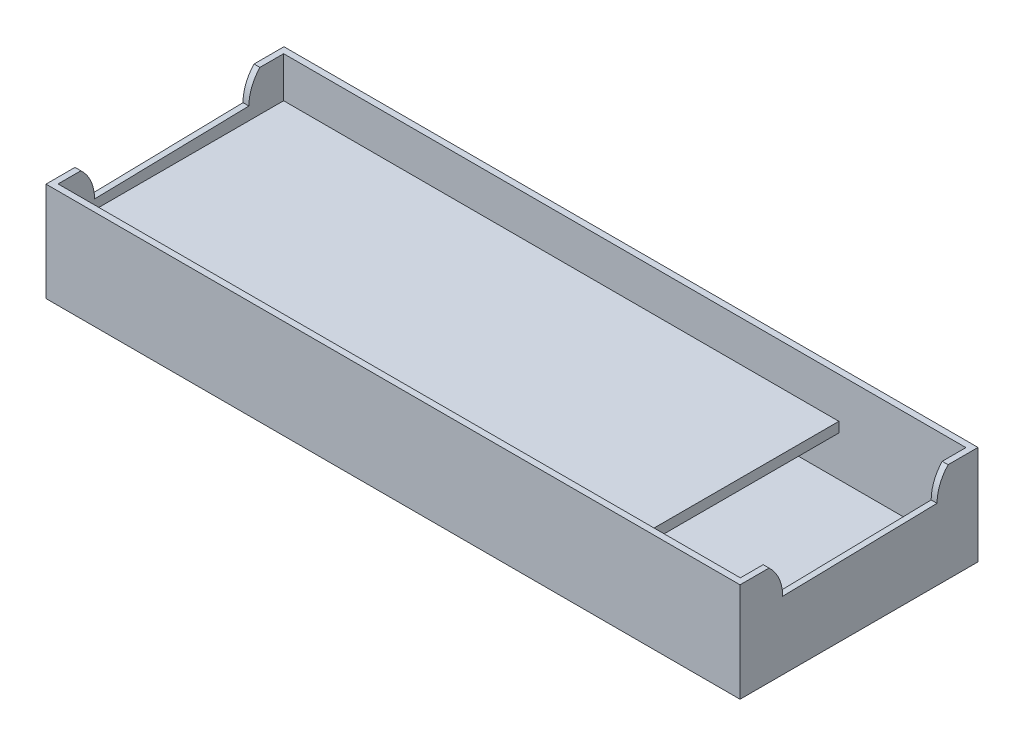
ISO-10303-21;
HEADER;
FILE_DESCRIPTION(('STEP AP214'),'2;1');
FILE_NAME('part.step','',(''),(''),'','','');
FILE_SCHEMA(('AUTOMOTIVE_DESIGN { 1 0 10303 214 1 1 1 1 }'));
ENDSEC;
DATA;
#1=APPLICATION_CONTEXT('core data for automotive mechanical design processes');
#2=APPLICATION_PROTOCOL_DEFINITION('international standard','automotive_design',2000,#1);
#3=PRODUCT_CONTEXT('',#1,'mechanical');
#4=PRODUCT('Part','Part','',(#3));
#5=PRODUCT_RELATED_PRODUCT_CATEGORY('part','',(#4));
#6=PRODUCT_DEFINITION_FORMATION('','',#4);
#7=PRODUCT_DEFINITION_CONTEXT('part definition',#1,'design');
#8=PRODUCT_DEFINITION('design','',#6,#7);
#9=PRODUCT_DEFINITION_SHAPE('','',#8);
#10=(LENGTH_UNIT() NAMED_UNIT(*) SI_UNIT(.MILLI.,.METRE.));
#11=(NAMED_UNIT(*) PLANE_ANGLE_UNIT() SI_UNIT($,.RADIAN.));
#12=(NAMED_UNIT(*) SI_UNIT($,.STERADIAN.) SOLID_ANGLE_UNIT());
#13=UNCERTAINTY_MEASURE_WITH_UNIT(LENGTH_MEASURE(1.E-05),#10,'distance_accuracy_value','');
#14=(GEOMETRIC_REPRESENTATION_CONTEXT(3) GLOBAL_UNCERTAINTY_ASSIGNED_CONTEXT((#13)) GLOBAL_UNIT_ASSIGNED_CONTEXT((#10,
#11,#12)) REPRESENTATION_CONTEXT('',''));
#15=CARTESIAN_POINT('',(0.,0.,0.));
#16=DIRECTION('',(0.,0.,1.));
#17=DIRECTION('',(1.,0.,0.));
#18=AXIS2_PLACEMENT_3D('',#15,#16,#17);
#19=CARTESIAN_POINT('',(-86.0187095266275,2.,-28.4391549564411));
#20=DIRECTION('',(-1.,0.,0.));
#21=DIRECTION('',(0.,0.,1.));
#22=AXIS2_PLACEMENT_3D('',#19,#20,#21);
#23=PLANE('',#22);
#24=DIRECTION('',(0.,0.,-1.));
#25=VECTOR('',#24,1.);
#26=CARTESIAN_POINT('',(-86.0187095266275,12.1793605566936,28.1805172130793));
#27=LINE('',#26,#25);
#28=CARTESIAN_POINT('',(-86.0187095266275,12.1793605566936,28.1805172130793));
#29=VERTEX_POINT('',#28);
#30=CARTESIAN_POINT('',(-86.0187095266275,12.1793605566936,-28.4391549564411));
#31=VERTEX_POINT('',#30);
#32=EDGE_CURVE('E533',#29,#31,#27,.T.);
#33=ORIENTED_EDGE('',*,*,#32,.F.);
#34=DIRECTION('',(0.,-1.,0.));
#35=VECTOR('',#34,1.);
#36=CARTESIAN_POINT('',(-86.0187095266275,14.7226214599172,28.1805172130793));
#37=LINE('',#36,#35);
#38=CARTESIAN_POINT('',(-86.0187095266275,14.7226214599172,28.1805172130793));
#39=VERTEX_POINT('',#38);
#40=EDGE_CURVE('E189',#39,#29,#37,.T.);
#41=ORIENTED_EDGE('',*,*,#40,.F.);
#42=DIRECTION('',(0.,0.,1.));
#43=VECTOR('',#42,1.);
#44=CARTESIAN_POINT('',(-86.0187095266275,14.7226214599172,28.1805172130793));
#45=LINE('',#44,#43);
#46=CARTESIAN_POINT('',(-86.0187095266275,14.7226214599172,-28.4391549564411));
#47=VERTEX_POINT('',#46);
#48=EDGE_CURVE('E185',#47,#39,#45,.T.);
#49=ORIENTED_EDGE('',*,*,#48,.F.);
#50=DIRECTION('',(0.,1.,0.));
#51=VECTOR('',#50,1.);
#52=CARTESIAN_POINT('',(-86.0187095266275,2.,-28.4391549564411));
#53=LINE('',#52,#51);
#54=CARTESIAN_POINT('',(-86.0187095266275,25.,-28.4391549564411));
#55=VERTEX_POINT('',#54);
#56=EDGE_CURVE('E269',#47,#55,#53,.T.);
#57=ORIENTED_EDGE('',*,*,#56,.T.);
#58=DIRECTION('',(0.,0.,1.));
#59=VECTOR('',#58,1.);
#60=CARTESIAN_POINT('',(-86.0187095266275,25.,-28.4391549564411));
#61=LINE('',#60,#59);
#62=CARTESIAN_POINT('',(-86.0187095266275,25.,-22.4526280085783));
#63=VERTEX_POINT('',#62);
#64=EDGE_CURVE('E255',#55,#63,#61,.T.);
#65=ORIENTED_EDGE('',*,*,#64,.T.);
#66=CARTESIAN_POINT('',(-86.0187095266275,17.9512963465704,-30.));
#67=DIRECTION('',(-1.,0.,0.));
#68=DIRECTION('',(0.,0.,1.));
#69=AXIS2_PLACEMENT_3D('',#66,#67,#68);
#70=CIRCLE('',#69,10.3270057214455);
#71=CARTESIAN_POINT('',(-86.0187095266275,17.9512963465704,-19.6729942785545));
#72=VERTEX_POINT('',#71);
#73=EDGE_CURVE('E12',#72,#63,#70,.T.);
#74=ORIENTED_EDGE('',*,*,#73,.F.);
#75=DIRECTION('',(0.,-0.0214904779381485,0.999769053010739));
#76=VECTOR('',#75,1.);
#77=CARTESIAN_POINT('',(-86.0187095266275,18.1322748644069,-28.0923845737996));
#78=LINE('',#77,#76);
#79=CARTESIAN_POINT('',(-86.0187095266275,17.1148019535767,19.2419712023932));
#80=VERTEX_POINT('',#79);
#81=EDGE_CURVE('E42',#72,#80,#78,.T.);
#82=ORIENTED_EDGE('',*,*,#81,.T.);
#83=CARTESIAN_POINT('',(-86.0187095266275,17.1148019535767,30.));
#84=DIRECTION('',(-1.,0.,0.));
#85=DIRECTION('',(0.,0.,1.));
#86=AXIS2_PLACEMENT_3D('',#83,#84,#85);
#87=CIRCLE('',#86,10.7580287976068);
#88=CARTESIAN_POINT('',(-86.0187095266275,25.,22.68160978228));
#89=VERTEX_POINT('',#88);
#90=EDGE_CURVE('E304',#89,#80,#87,.T.);
#91=ORIENTED_EDGE('',*,*,#90,.F.);
#92=CARTESIAN_POINT('',(-86.0187095266275,25.,28.4391549564411));
#93=VERTEX_POINT('',#92);
#94=EDGE_CURVE('E254',#89,#93,#61,.T.);
#95=ORIENTED_EDGE('',*,*,#94,.T.);
#96=DIRECTION('',(0.,1.,0.));
#97=VECTOR('',#96,1.);
#98=CARTESIAN_POINT('',(-86.0187095266275,2.,28.4391549564411));
#99=LINE('',#98,#97);
#100=CARTESIAN_POINT('',(-86.0187095266275,2.,28.4391549564411));
#101=VERTEX_POINT('',#100);
#102=EDGE_CURVE('E263',#101,#93,#99,.T.);
#103=ORIENTED_EDGE('',*,*,#102,.F.);
#104=DIRECTION('',(0.,0.,1.));
#105=VECTOR('',#104,1.);
#106=CARTESIAN_POINT('',(-86.0187095266275,2.,-28.4391549564411));
#107=LINE('',#106,#105);
#108=CARTESIAN_POINT('',(-86.0187095266275,2.,-28.4391549564411));
#109=VERTEX_POINT('',#108);
#110=EDGE_CURVE('E241',#109,#101,#107,.T.);
#111=ORIENTED_EDGE('',*,*,#110,.F.);
#112=EDGE_CURVE('E266',#109,#31,#53,.T.);
#113=ORIENTED_EDGE('',*,*,#112,.T.);
#114=EDGE_LOOP('',(#33,#41,#49,#57,#65,#74,#82,#91,#95,#103,#111,#113));
#115=FACE_BOUND('',#114,.T.);
#116=ADVANCED_FACE('F34',(#115),#23,.F.);
#117=CARTESIAN_POINT('',(-86.0187095266275,2.,-28.4391549564411));
#118=DIRECTION('',(0.,0.,-1.));
#119=DIRECTION('',(-1.,0.,0.));
#120=AXIS2_PLACEMENT_3D('',#117,#118,#119);
#121=PLANE('',#120);
#122=DIRECTION('',(-1.,0.,0.));
#123=VECTOR('',#122,1.);
#124=CARTESIAN_POINT('',(53.9812904733725,12.1793605566936,-28.4391549564411));
#125=LINE('',#124,#123);
#126=CARTESIAN_POINT('',(53.9812904733725,12.1793605566936,-28.4391549564411));
#127=VERTEX_POINT('',#126);
#128=EDGE_CURVE('E49',#127,#31,#125,.T.);
#129=ORIENTED_EDGE('',*,*,#128,.T.);
#130=ORIENTED_EDGE('',*,*,#112,.F.);
#131=DIRECTION('',(-1.,0.,0.));
#132=VECTOR('',#131,1.);
#133=CARTESIAN_POINT('',(-86.0187095266275,2.,-28.4391549564411));
#134=LINE('',#133,#132);
#135=CARTESIAN_POINT('',(86.0187095266275,2.,-28.4391549564411));
#136=VERTEX_POINT('',#135);
#137=EDGE_CURVE('E237',#136,#109,#134,.T.);
#138=ORIENTED_EDGE('',*,*,#137,.F.);
#139=DIRECTION('',(0.,1.,0.));
#140=VECTOR('',#139,1.);
#141=CARTESIAN_POINT('',(86.0187095266275,2.,-28.4391549564411));
#142=LINE('',#141,#140);
#143=CARTESIAN_POINT('',(86.0187095266275,25.,-28.4391549564411));
#144=VERTEX_POINT('',#143);
#145=EDGE_CURVE('E247',#136,#144,#142,.T.);
#146=ORIENTED_EDGE('',*,*,#145,.T.);
#147=DIRECTION('',(-1.,0.,0.));
#148=VECTOR('',#147,1.);
#149=CARTESIAN_POINT('',(-86.0187095266275,25.,-28.4391549564411));
#150=LINE('',#149,#148);
#151=EDGE_CURVE('E251',#144,#55,#150,.T.);
#152=ORIENTED_EDGE('',*,*,#151,.T.);
#153=ORIENTED_EDGE('',*,*,#56,.F.);
#154=DIRECTION('',(-1.,0.,0.));
#155=VECTOR('',#154,1.);
#156=CARTESIAN_POINT('',(53.9812904733725,14.7226214599172,-28.4391549564411));
#157=LINE('',#156,#155);
#158=CARTESIAN_POINT('',(53.9812904733725,14.7226214599172,-28.4391549564411));
#159=VERTEX_POINT('',#158);
#160=EDGE_CURVE('E196',#159,#47,#157,.T.);
#161=ORIENTED_EDGE('',*,*,#160,.F.);
#162=DIRECTION('',(0.,1.,0.));
#163=VECTOR('',#162,1.);
#164=CARTESIAN_POINT('',(53.9812904733725,14.7226214599172,-28.4391549564411));
#165=LINE('',#164,#163);
#166=EDGE_CURVE('E175',#127,#159,#165,.T.);
#167=ORIENTED_EDGE('',*,*,#166,.F.);
#168=EDGE_LOOP('',(#129,#130,#138,#146,#152,#153,#161,#167));
#169=FACE_BOUND('',#168,.T.);
#170=ADVANCED_FACE('F368',(#169),#121,.F.);
#171=CARTESIAN_POINT('',(87.5,25.,-30.));
#172=DIRECTION('',(-1.,0.,0.));
#173=DIRECTION('',(0.,0.,1.));
#174=AXIS2_PLACEMENT_3D('',#171,#172,#173);
#175=PLANE('',#174);
#176=CARTESIAN_POINT('',(87.5,17.9512963465704,-30.));
#177=DIRECTION('',(1.,0.,0.));
#178=DIRECTION('',(0.,0.,-1.));
#179=AXIS2_PLACEMENT_3D('',#176,#177,#178);
#180=CIRCLE('',#179,10.3270057214455);
#181=CARTESIAN_POINT('',(87.5,25.,-22.4526280085783));
#182=VERTEX_POINT('',#181);
#183=CARTESIAN_POINT('',(87.5,17.9512963465704,-19.6729942785545));
#184=VERTEX_POINT('',#183);
#185=EDGE_CURVE('E191',#182,#184,#180,.T.);
#186=ORIENTED_EDGE('',*,*,#185,.T.);
#187=DIRECTION('',(0.,0.0214904779381485,-0.999769053010739));
#188=VECTOR('',#187,1.);
#189=CARTESIAN_POINT('',(87.5,17.5203212990617,0.376607054612156));
#190=LINE('',#189,#188);
#191=CARTESIAN_POINT('',(87.5,17.1148019535767,19.2419712023932));
#192=VERTEX_POINT('',#191);
#193=EDGE_CURVE('E203',#192,#184,#190,.T.);
#194=ORIENTED_EDGE('',*,*,#193,.F.);
#195=CARTESIAN_POINT('',(87.5,17.1148019535767,30.));
#196=DIRECTION('',(1.,0.,0.));
#197=DIRECTION('',(0.,0.,-1.));
#198=AXIS2_PLACEMENT_3D('',#195,#196,#197);
#199=CIRCLE('',#198,10.7580287976068);
#200=CARTESIAN_POINT('',(87.5,25.,22.68160978228));
#201=VERTEX_POINT('',#200);
#202=EDGE_CURVE('E194',#192,#201,#199,.T.);
#203=ORIENTED_EDGE('',*,*,#202,.T.);
#204=DIRECTION('',(0.,0.,-1.));
#205=VECTOR('',#204,1.);
#206=CARTESIAN_POINT('',(87.5,25.,-30.));
#207=LINE('',#206,#205);
#208=CARTESIAN_POINT('',(87.5,25.,30.));
#209=VERTEX_POINT('',#208);
#210=EDGE_CURVE('E272',#209,#201,#207,.T.);
#211=ORIENTED_EDGE('',*,*,#210,.F.);
#212=DIRECTION('',(0.,-1.,0.));
#213=VECTOR('',#212,1.);
#214=CARTESIAN_POINT('',(87.5,25.,30.));
#215=LINE('',#214,#213);
#216=CARTESIAN_POINT('',(87.5,0.,30.));
#217=VERTEX_POINT('',#216);
#218=EDGE_CURVE('E284',#209,#217,#215,.T.);
#219=ORIENTED_EDGE('',*,*,#218,.T.);
#220=DIRECTION('',(0.,0.,-1.));
#221=VECTOR('',#220,1.);
#222=CARTESIAN_POINT('',(87.5,0.,-30.));
#223=LINE('',#222,#221);
#224=CARTESIAN_POINT('',(87.5,0.,-30.));
#225=VERTEX_POINT('',#224);
#226=EDGE_CURVE('E262',#217,#225,#223,.T.);
#227=ORIENTED_EDGE('',*,*,#226,.T.);
#228=DIRECTION('',(0.,-1.,0.));
#229=VECTOR('',#228,1.);
#230=CARTESIAN_POINT('',(87.5,25.,-30.));
#231=LINE('',#230,#229);
#232=CARTESIAN_POINT('',(87.5,25.,-30.));
#233=VERTEX_POINT('',#232);
#234=EDGE_CURVE('E301',#233,#225,#231,.T.);
#235=ORIENTED_EDGE('',*,*,#234,.F.);
#236=EDGE_CURVE('E276',#182,#233,#207,.T.);
#237=ORIENTED_EDGE('',*,*,#236,.F.);
#238=EDGE_LOOP('',(#186,#194,#203,#211,#219,#227,#235,#237));
#239=FACE_BOUND('',#238,.T.);
#240=ADVANCED_FACE('F36',(#239),#175,.F.);
#241=CARTESIAN_POINT('',(-87.5,25.,-30.));
#242=DIRECTION('',(1.,0.,0.));
#243=DIRECTION('',(0.,0.,-1.));
#244=AXIS2_PLACEMENT_3D('',#241,#242,#243);
#245=PLANE('',#244);
#246=CARTESIAN_POINT('',(-87.5,17.9512963465704,-30.));
#247=DIRECTION('',(1.,0.,0.));
#248=DIRECTION('',(0.,0.,-1.));
#249=AXIS2_PLACEMENT_3D('',#246,#247,#248);
#250=CIRCLE('',#249,10.3270057214455);
#251=CARTESIAN_POINT('',(-87.5,25.,-22.4526280085783));
#252=VERTEX_POINT('',#251);
#253=CARTESIAN_POINT('',(-87.5,17.9512963465704,-19.6729942785545));
#254=VERTEX_POINT('',#253);
#255=EDGE_CURVE('E200',#252,#254,#250,.T.);
#256=ORIENTED_EDGE('',*,*,#255,.F.);
#257=DIRECTION('',(0.,0.,1.));
#258=VECTOR('',#257,1.);
#259=CARTESIAN_POINT('',(-87.5,25.,-30.));
#260=LINE('',#259,#258);
#261=CARTESIAN_POINT('',(-87.5,25.,-30.));
#262=VERTEX_POINT('',#261);
#263=EDGE_CURVE('E279',#262,#252,#260,.T.);
#264=ORIENTED_EDGE('',*,*,#263,.F.);
#265=DIRECTION('',(0.,-1.,0.));
#266=VECTOR('',#265,1.);
#267=CARTESIAN_POINT('',(-87.5,25.,-30.));
#268=LINE('',#267,#266);
#269=CARTESIAN_POINT('',(-87.5,0.,-30.));
#270=VERTEX_POINT('',#269);
#271=EDGE_CURVE('E298',#262,#270,#268,.T.);
#272=ORIENTED_EDGE('',*,*,#271,.T.);
#273=DIRECTION('',(0.,0.,1.));
#274=VECTOR('',#273,1.);
#275=CARTESIAN_POINT('',(-87.5,0.,-30.));
#276=LINE('',#275,#274);
#277=CARTESIAN_POINT('',(-87.5,0.,30.));
#278=VERTEX_POINT('',#277);
#279=EDGE_CURVE('E289',#270,#278,#276,.T.);
#280=ORIENTED_EDGE('',*,*,#279,.T.);
#281=DIRECTION('',(0.,-1.,0.));
#282=VECTOR('',#281,1.);
#283=CARTESIAN_POINT('',(-87.5,25.,30.));
#284=LINE('',#283,#282);
#285=CARTESIAN_POINT('',(-87.5,25.,30.));
#286=VERTEX_POINT('',#285);
#287=EDGE_CURVE('E295',#286,#278,#284,.T.);
#288=ORIENTED_EDGE('',*,*,#287,.F.);
#289=CARTESIAN_POINT('',(-87.5,25.,22.68160978228));
#290=VERTEX_POINT('',#289);
#291=EDGE_CURVE('E278',#290,#286,#260,.T.);
#292=ORIENTED_EDGE('',*,*,#291,.F.);
#293=CARTESIAN_POINT('',(-87.5,17.1148019535767,30.));
#294=DIRECTION('',(1.,0.,0.));
#295=DIRECTION('',(0.,0.,-1.));
#296=AXIS2_PLACEMENT_3D('',#293,#294,#295);
#297=CIRCLE('',#296,10.7580287976068);
#298=CARTESIAN_POINT('',(-87.5,17.1148019535767,19.2419712023932));
#299=VERTEX_POINT('',#298);
#300=EDGE_CURVE('E202',#299,#290,#297,.T.);
#301=ORIENTED_EDGE('',*,*,#300,.F.);
#302=DIRECTION('',(0.,0.0214904779381485,-0.999769053010739));
#303=VECTOR('',#302,1.);
#304=CARTESIAN_POINT('',(-87.5,17.5203212990617,0.376607054612156));
#305=LINE('',#304,#303);
#306=EDGE_CURVE('E205',#299,#254,#305,.T.);
#307=ORIENTED_EDGE('',*,*,#306,.T.);
#308=EDGE_LOOP('',(#256,#264,#272,#280,#288,#292,#301,#307));
#309=FACE_BOUND('',#308,.T.);
#310=ADVANCED_FACE('F319',(#309),#245,.F.);
#311=CARTESIAN_POINT('',(0.,25.,0.));
#312=DIRECTION('',(0.,1.,0.));
#313=DIRECTION('',(0.,0.,1.));
#314=AXIS2_PLACEMENT_3D('',#311,#312,#313);
#315=PLANE('',#314);
#316=ORIENTED_EDGE('',*,*,#263,.T.);
#317=DIRECTION('',(1.,0.,0.));
#318=VECTOR('',#317,1.);
#319=CARTESIAN_POINT('',(-87.5,25.,-22.4526280085783));
#320=LINE('',#319,#318);
#321=EDGE_CURVE('E224',#252,#63,#320,.T.);
#322=ORIENTED_EDGE('',*,*,#321,.T.);
#323=ORIENTED_EDGE('',*,*,#64,.F.);
#324=ORIENTED_EDGE('',*,*,#151,.F.);
#325=DIRECTION('',(0.,0.,-1.));
#326=VECTOR('',#325,1.);
#327=CARTESIAN_POINT('',(86.0187095266275,25.,-28.4391549564411));
#328=LINE('',#327,#326);
#329=CARTESIAN_POINT('',(86.0187095266275,25.,-22.4526280085783));
#330=VERTEX_POINT('',#329);
#331=EDGE_CURVE('E233',#330,#144,#328,.T.);
#332=ORIENTED_EDGE('',*,*,#331,.F.);
#333=EDGE_CURVE('E207',#330,#182,#320,.T.);
#334=ORIENTED_EDGE('',*,*,#333,.T.);
#335=ORIENTED_EDGE('',*,*,#236,.T.);
#336=DIRECTION('',(-1.,0.,0.));
#337=VECTOR('',#336,1.);
#338=CARTESIAN_POINT('',(-87.5,25.,-30.));
#339=LINE('',#338,#337);
#340=EDGE_CURVE('E275',#233,#262,#339,.T.);
#341=ORIENTED_EDGE('',*,*,#340,.T.);
#342=EDGE_LOOP('',(#316,#322,#323,#324,#332,#334,#335,#341));
#343=FACE_BOUND('',#342,.T.);
#344=ADVANCED_FACE('F322',(#343),#315,.T.);
#345=ORIENTED_EDGE('',*,*,#210,.T.);
#346=DIRECTION('',(1.,0.,0.));
#347=VECTOR('',#346,1.);
#348=CARTESIAN_POINT('',(-87.5,25.,22.68160978228));
#349=LINE('',#348,#347);
#350=CARTESIAN_POINT('',(86.0187095266275,25.,22.68160978228));
#351=VERTEX_POINT('',#350);
#352=EDGE_CURVE('E223',#351,#201,#349,.T.);
#353=ORIENTED_EDGE('',*,*,#352,.F.);
#354=CARTESIAN_POINT('',(86.0187095266275,25.,28.4391549564411));
#355=VERTEX_POINT('',#354);
#356=EDGE_CURVE('E248',#355,#351,#328,.T.);
#357=ORIENTED_EDGE('',*,*,#356,.F.);
#358=DIRECTION('',(1.,0.,0.));
#359=VECTOR('',#358,1.);
#360=CARTESIAN_POINT('',(-86.0187095266275,25.,28.4391549564411));
#361=LINE('',#360,#359);
#362=EDGE_CURVE('E238',#93,#355,#361,.T.);
#363=ORIENTED_EDGE('',*,*,#362,.F.);
#364=ORIENTED_EDGE('',*,*,#94,.F.);
#365=EDGE_CURVE('E221',#290,#89,#349,.T.);
#366=ORIENTED_EDGE('',*,*,#365,.F.);
#367=ORIENTED_EDGE('',*,*,#291,.T.);
#368=DIRECTION('',(1.,0.,0.));
#369=VECTOR('',#368,1.);
#370=CARTESIAN_POINT('',(-87.5,25.,30.));
#371=LINE('',#370,#369);
#372=EDGE_CURVE('E282',#286,#209,#371,.T.);
#373=ORIENTED_EDGE('',*,*,#372,.T.);
#374=EDGE_LOOP('',(#345,#353,#357,#363,#364,#366,#367,#373));
#375=FACE_BOUND('',#374,.T.);
#376=ADVANCED_FACE('F346',(#375),#315,.T.);
#377=CARTESIAN_POINT('',(86.0187095266275,2.,-28.4391549564411));
#378=DIRECTION('',(1.,0.,0.));
#379=DIRECTION('',(0.,0.,-1.));
#380=AXIS2_PLACEMENT_3D('',#377,#378,#379);
#381=PLANE('',#380);
#382=CARTESIAN_POINT('',(86.0187095266275,17.9512963465704,-30.));
#383=DIRECTION('',(1.,0.,0.));
#384=DIRECTION('',(0.,0.,-1.));
#385=AXIS2_PLACEMENT_3D('',#382,#383,#384);
#386=CIRCLE('',#385,10.3270057214455);
#387=CARTESIAN_POINT('',(86.0187095266275,17.9512963465704,-19.6729942785545));
#388=VERTEX_POINT('',#387);
#389=EDGE_CURVE('E231',#330,#388,#386,.T.);
#390=ORIENTED_EDGE('',*,*,#389,.F.);
#391=ORIENTED_EDGE('',*,*,#331,.T.);
#392=ORIENTED_EDGE('',*,*,#145,.F.);
#393=DIRECTION('',(0.,0.,-1.));
#394=VECTOR('',#393,1.);
#395=CARTESIAN_POINT('',(86.0187095266275,2.,-28.4391549564411));
#396=LINE('',#395,#394);
#397=CARTESIAN_POINT('',(86.0187095266275,2.,28.4391549564411));
#398=VERTEX_POINT('',#397);
#399=EDGE_CURVE('E234',#398,#136,#396,.T.);
#400=ORIENTED_EDGE('',*,*,#399,.F.);
#401=DIRECTION('',(0.,1.,0.));
#402=VECTOR('',#401,1.);
#403=CARTESIAN_POINT('',(86.0187095266275,2.,28.4391549564411));
#404=LINE('',#403,#402);
#405=EDGE_CURVE('E260',#398,#355,#404,.T.);
#406=ORIENTED_EDGE('',*,*,#405,.T.);
#407=ORIENTED_EDGE('',*,*,#356,.T.);
#408=CARTESIAN_POINT('',(86.0187095266275,17.1148019535767,30.));
#409=DIRECTION('',(1.,0.,0.));
#410=DIRECTION('',(0.,0.,-1.));
#411=AXIS2_PLACEMENT_3D('',#408,#409,#410);
#412=CIRCLE('',#411,10.7580287976068);
#413=CARTESIAN_POINT('',(86.0187095266275,17.1148019535767,19.2419712023932));
#414=VERTEX_POINT('',#413);
#415=EDGE_CURVE('E216',#414,#351,#412,.T.);
#416=ORIENTED_EDGE('',*,*,#415,.F.);
#417=DIRECTION('',(0.,0.0214904779381485,-0.999769053010739));
#418=VECTOR('',#417,1.);
#419=CARTESIAN_POINT('',(86.0187095266275,18.1322748644069,-28.0923845737996));
#420=LINE('',#419,#418);
#421=EDGE_CURVE('E228',#414,#388,#420,.T.);
#422=ORIENTED_EDGE('',*,*,#421,.T.);
#423=EDGE_LOOP('',(#390,#391,#392,#400,#406,#407,#416,#422));
#424=FACE_BOUND('',#423,.T.);
#425=ADVANCED_FACE('F377',(#424),#381,.F.);
#426=CARTESIAN_POINT('',(-87.5,25.,-30.));
#427=DIRECTION('',(0.,0.,1.));
#428=DIRECTION('',(1.,0.,0.));
#429=AXIS2_PLACEMENT_3D('',#426,#427,#428);
#430=PLANE('',#429);
#431=DIRECTION('',(-1.,0.,0.));
#432=VECTOR('',#431,1.);
#433=CARTESIAN_POINT('',(-87.5,0.,-30.));
#434=LINE('',#433,#432);
#435=EDGE_CURVE('E287',#225,#270,#434,.T.);
#436=ORIENTED_EDGE('',*,*,#435,.T.);
#437=ORIENTED_EDGE('',*,*,#271,.F.);
#438=ORIENTED_EDGE('',*,*,#340,.F.);
#439=ORIENTED_EDGE('',*,*,#234,.T.);
#440=EDGE_LOOP('',(#436,#437,#438,#439));
#441=FACE_BOUND('',#440,.T.);
#442=ADVANCED_FACE('F330',(#441),#430,.F.);
#443=CARTESIAN_POINT('',(-87.5,25.,30.));
#444=DIRECTION('',(0.,0.,-1.));
#445=DIRECTION('',(-1.,0.,0.));
#446=AXIS2_PLACEMENT_3D('',#443,#444,#445);
#447=PLANE('',#446);
#448=DIRECTION('',(1.,0.,0.));
#449=VECTOR('',#448,1.);
#450=CARTESIAN_POINT('',(-87.5,0.,30.));
#451=LINE('',#450,#449);
#452=EDGE_CURVE('E291',#278,#217,#451,.T.);
#453=ORIENTED_EDGE('',*,*,#452,.T.);
#454=ORIENTED_EDGE('',*,*,#218,.F.);
#455=ORIENTED_EDGE('',*,*,#372,.F.);
#456=ORIENTED_EDGE('',*,*,#287,.T.);
#457=EDGE_LOOP('',(#453,#454,#455,#456));
#458=FACE_BOUND('',#457,.T.);
#459=ADVANCED_FACE('F339',(#458),#447,.F.);
#460=CARTESIAN_POINT('',(0.,0.,0.));
#461=DIRECTION('',(0.,1.,0.));
#462=DIRECTION('',(0.,0.,1.));
#463=AXIS2_PLACEMENT_3D('',#460,#461,#462);
#464=PLANE('',#463);
#465=ORIENTED_EDGE('',*,*,#226,.F.);
#466=ORIENTED_EDGE('',*,*,#452,.F.);
#467=ORIENTED_EDGE('',*,*,#279,.F.);
#468=ORIENTED_EDGE('',*,*,#435,.F.);
#469=EDGE_LOOP('',(#465,#466,#467,#468));
#470=FACE_BOUND('',#469,.T.);
#471=ADVANCED_FACE('F336',(#470),#464,.F.);
#472=CARTESIAN_POINT('',(-86.0187095266275,2.,28.4391549564411));
#473=DIRECTION('',(0.,0.,1.));
#474=DIRECTION('',(1.,0.,0.));
#475=AXIS2_PLACEMENT_3D('',#472,#473,#474);
#476=PLANE('',#475);
#477=ORIENTED_EDGE('',*,*,#362,.T.);
#478=ORIENTED_EDGE('',*,*,#405,.F.);
#479=DIRECTION('',(1.,0.,0.));
#480=VECTOR('',#479,1.);
#481=CARTESIAN_POINT('',(-86.0187095266275,2.,28.4391549564411));
#482=LINE('',#481,#480);
#483=EDGE_CURVE('E244',#101,#398,#482,.T.);
#484=ORIENTED_EDGE('',*,*,#483,.F.);
#485=ORIENTED_EDGE('',*,*,#102,.T.);
#486=EDGE_LOOP('',(#477,#478,#484,#485));
#487=FACE_BOUND('',#486,.T.);
#488=ADVANCED_FACE('F362',(#487),#476,.F.);
#489=CARTESIAN_POINT('',(0.,2.,0.));
#490=DIRECTION('',(0.,1.,0.));
#491=DIRECTION('',(0.,0.,1.));
#492=AXIS2_PLACEMENT_3D('',#489,#490,#491);
#493=PLANE('',#492);
#494=ORIENTED_EDGE('',*,*,#399,.T.);
#495=ORIENTED_EDGE('',*,*,#137,.T.);
#496=ORIENTED_EDGE('',*,*,#110,.T.);
#497=ORIENTED_EDGE('',*,*,#483,.T.);
#498=EDGE_LOOP('',(#494,#495,#496,#497));
#499=FACE_BOUND('',#498,.T.);
#500=ADVANCED_FACE('F353',(#499),#493,.T.);
#501=CARTESIAN_POINT('',(-87.5,17.1148019535767,30.));
#502=DIRECTION('',(1.,0.,0.));
#503=DIRECTION('',(0.,0.,-1.));
#504=AXIS2_PLACEMENT_3D('',#501,#502,#503);
#505=CYLINDRICAL_SURFACE('',#504,10.7580287976068);
#506=ORIENTED_EDGE('',*,*,#90,.T.);
#507=DIRECTION('',(1.,0.,0.));
#508=VECTOR('',#507,1.);
#509=CARTESIAN_POINT('',(-87.5,17.1148019535767,19.2419712023932));
#510=LINE('',#509,#508);
#511=EDGE_CURVE('E218',#299,#80,#510,.T.);
#512=ORIENTED_EDGE('',*,*,#511,.F.);
#513=ORIENTED_EDGE('',*,*,#300,.T.);
#514=ORIENTED_EDGE('',*,*,#365,.T.);
#515=EDGE_LOOP('',(#506,#512,#513,#514));
#516=FACE_BOUND('',#515,.T.);
#517=ADVANCED_FACE('F351',(#516),#505,.T.);
#518=CARTESIAN_POINT('',(-87.5,17.5203212990617,0.376607054612156));
#519=DIRECTION('',(0.,-0.999769053010739,-0.0214904779381485));
#520=DIRECTION('',(0.,0.0214904779381485,-0.999769053010739));
#521=AXIS2_PLACEMENT_3D('',#518,#519,#520);
#522=PLANE('',#521);
#523=DIRECTION('',(1.,0.,0.));
#524=VECTOR('',#523,1.);
#525=CARTESIAN_POINT('',(-87.5,17.9512963465704,-19.6729942785545));
#526=LINE('',#525,#524);
#527=EDGE_CURVE('E213',#254,#72,#526,.T.);
#528=ORIENTED_EDGE('',*,*,#527,.F.);
#529=ORIENTED_EDGE('',*,*,#306,.F.);
#530=ORIENTED_EDGE('',*,*,#511,.T.);
#531=ORIENTED_EDGE('',*,*,#81,.F.);
#532=EDGE_LOOP('',(#528,#529,#530,#531));
#533=FACE_BOUND('',#532,.T.);
#534=ADVANCED_FACE('F312',(#533),#522,.F.);
#535=CARTESIAN_POINT('',(-87.5,17.9512963465704,-30.));
#536=DIRECTION('',(1.,0.,0.));
#537=DIRECTION('',(0.,0.,-1.));
#538=AXIS2_PLACEMENT_3D('',#535,#536,#537);
#539=CYLINDRICAL_SURFACE('',#538,10.3270057214455);
#540=ORIENTED_EDGE('',*,*,#73,.T.);
#541=ORIENTED_EDGE('',*,*,#321,.F.);
#542=ORIENTED_EDGE('',*,*,#255,.T.);
#543=ORIENTED_EDGE('',*,*,#527,.T.);
#544=EDGE_LOOP('',(#540,#541,#542,#543));
#545=FACE_BOUND('',#544,.T.);
#546=ADVANCED_FACE('F315',(#545),#539,.T.);
#547=ORIENTED_EDGE('',*,*,#389,.T.);
#548=EDGE_CURVE('E217',#388,#184,#526,.T.);
#549=ORIENTED_EDGE('',*,*,#548,.T.);
#550=ORIENTED_EDGE('',*,*,#185,.F.);
#551=ORIENTED_EDGE('',*,*,#333,.F.);
#552=EDGE_LOOP('',(#547,#549,#550,#551));
#553=FACE_BOUND('',#552,.T.);
#554=ADVANCED_FACE('F460',(#553),#539,.T.);
#555=EDGE_CURVE('E57',#414,#192,#510,.T.);
#556=ORIENTED_EDGE('',*,*,#555,.T.);
#557=ORIENTED_EDGE('',*,*,#193,.T.);
#558=ORIENTED_EDGE('',*,*,#548,.F.);
#559=ORIENTED_EDGE('',*,*,#421,.F.);
#560=EDGE_LOOP('',(#556,#557,#558,#559));
#561=FACE_BOUND('',#560,.T.);
#562=ADVANCED_FACE('F361',(#561),#522,.F.);
#563=ORIENTED_EDGE('',*,*,#415,.T.);
#564=ORIENTED_EDGE('',*,*,#352,.T.);
#565=ORIENTED_EDGE('',*,*,#202,.F.);
#566=ORIENTED_EDGE('',*,*,#555,.F.);
#567=EDGE_LOOP('',(#563,#564,#565,#566));
#568=FACE_BOUND('',#567,.T.);
#569=ADVANCED_FACE('F355',(#568),#505,.T.);
#570=CARTESIAN_POINT('',(53.9812904733725,14.7226214599172,28.1805172130793));
#571=DIRECTION('',(0.,0.,-1.));
#572=DIRECTION('',(-1.,0.,0.));
#573=AXIS2_PLACEMENT_3D('',#570,#571,#572);
#574=PLANE('',#573);
#575=ORIENTED_EDGE('',*,*,#40,.T.);
#576=DIRECTION('',(-1.,0.,0.));
#577=VECTOR('',#576,1.);
#578=CARTESIAN_POINT('',(53.9812904733725,12.1793605566936,28.1805172130793));
#579=LINE('',#578,#577);
#580=CARTESIAN_POINT('',(53.9812904733725,12.1793605566936,28.1805172130793));
#581=VERTEX_POINT('',#580);
#582=EDGE_CURVE('E171',#581,#29,#579,.T.);
#583=ORIENTED_EDGE('',*,*,#582,.F.);
#584=DIRECTION('',(0.,-1.,0.));
#585=VECTOR('',#584,1.);
#586=CARTESIAN_POINT('',(53.9812904733725,14.7226214599172,28.1805172130793));
#587=LINE('',#586,#585);
#588=CARTESIAN_POINT('',(53.9812904733725,14.7226214599172,28.1805172130793));
#589=VERTEX_POINT('',#588);
#590=EDGE_CURVE('E176',#589,#581,#587,.T.);
#591=ORIENTED_EDGE('',*,*,#590,.F.);
#592=DIRECTION('',(-1.,0.,0.));
#593=VECTOR('',#592,1.);
#594=CARTESIAN_POINT('',(53.9812904733725,14.7226214599172,28.1805172130793));
#595=LINE('',#594,#593);
#596=EDGE_CURVE('E530',#589,#39,#595,.T.);
#597=ORIENTED_EDGE('',*,*,#596,.T.);
#598=EDGE_LOOP('',(#575,#583,#591,#597));
#599=FACE_BOUND('',#598,.T.);
#600=ADVANCED_FACE('F187',(#599),#574,.F.);
#601=CARTESIAN_POINT('',(53.9812904733725,12.1793605566936,28.1805172130793));
#602=DIRECTION('',(0.,1.,0.));
#603=DIRECTION('',(0.,0.,1.));
#604=AXIS2_PLACEMENT_3D('',#601,#602,#603);
#605=PLANE('',#604);
#606=ORIENTED_EDGE('',*,*,#32,.T.);
#607=ORIENTED_EDGE('',*,*,#128,.F.);
#608=DIRECTION('',(0.,0.,-1.));
#609=VECTOR('',#608,1.);
#610=CARTESIAN_POINT('',(53.9812904733725,12.1793605566936,28.1805172130793));
#611=LINE('',#610,#609);
#612=EDGE_CURVE('E167',#581,#127,#611,.T.);
#613=ORIENTED_EDGE('',*,*,#612,.F.);
#614=ORIENTED_EDGE('',*,*,#582,.T.);
#615=EDGE_LOOP('',(#606,#607,#613,#614));
#616=FACE_BOUND('',#615,.T.);
#617=ADVANCED_FACE('F169',(#616),#605,.F.);
#618=CARTESIAN_POINT('',(53.9812904733725,14.7226214599172,28.1805172130793));
#619=DIRECTION('',(0.,-1.,0.));
#620=DIRECTION('',(0.,0.,-1.));
#621=AXIS2_PLACEMENT_3D('',#618,#619,#620);
#622=PLANE('',#621);
#623=ORIENTED_EDGE('',*,*,#48,.T.);
#624=ORIENTED_EDGE('',*,*,#596,.F.);
#625=DIRECTION('',(0.,0.,1.));
#626=VECTOR('',#625,1.);
#627=CARTESIAN_POINT('',(53.9812904733725,14.7226214599172,28.1805172130793));
#628=LINE('',#627,#626);
#629=EDGE_CURVE('E181',#159,#589,#628,.T.);
#630=ORIENTED_EDGE('',*,*,#629,.F.);
#631=ORIENTED_EDGE('',*,*,#160,.T.);
#632=EDGE_LOOP('',(#623,#624,#630,#631));
#633=FACE_BOUND('',#632,.T.);
#634=ADVANCED_FACE('F508',(#633),#622,.F.);
#635=CARTESIAN_POINT('',(53.9812904733725,0.,0.));
#636=DIRECTION('',(1.,0.,0.));
#637=DIRECTION('',(0.,0.,-1.));
#638=AXIS2_PLACEMENT_3D('',#635,#636,#637);
#639=PLANE('',#638);
#640=ORIENTED_EDGE('',*,*,#590,.T.);
#641=ORIENTED_EDGE('',*,*,#612,.T.);
#642=ORIENTED_EDGE('',*,*,#166,.T.);
#643=ORIENTED_EDGE('',*,*,#629,.T.);
#644=EDGE_LOOP('',(#640,#641,#642,#643));
#645=FACE_BOUND('',#644,.T.);
#646=ADVANCED_FACE('F179',(#645),#639,.T.);
#647=CLOSED_SHELL('',(#116,#170,#240,#310,#344,#376,#425,#442,#459,#471,#488,#500,#517,#534,
#546,#554,#562,#569,#600,#617,#634,#646));
#648=MANIFOLD_SOLID_BREP('B2',#647);
#649=ADVANCED_BREP_SHAPE_REPRESENTATION('',(#18,#648),#14);
#650=SHAPE_DEFINITION_REPRESENTATION(#9,#649);
ENDSEC;
END-ISO-10303-21;
